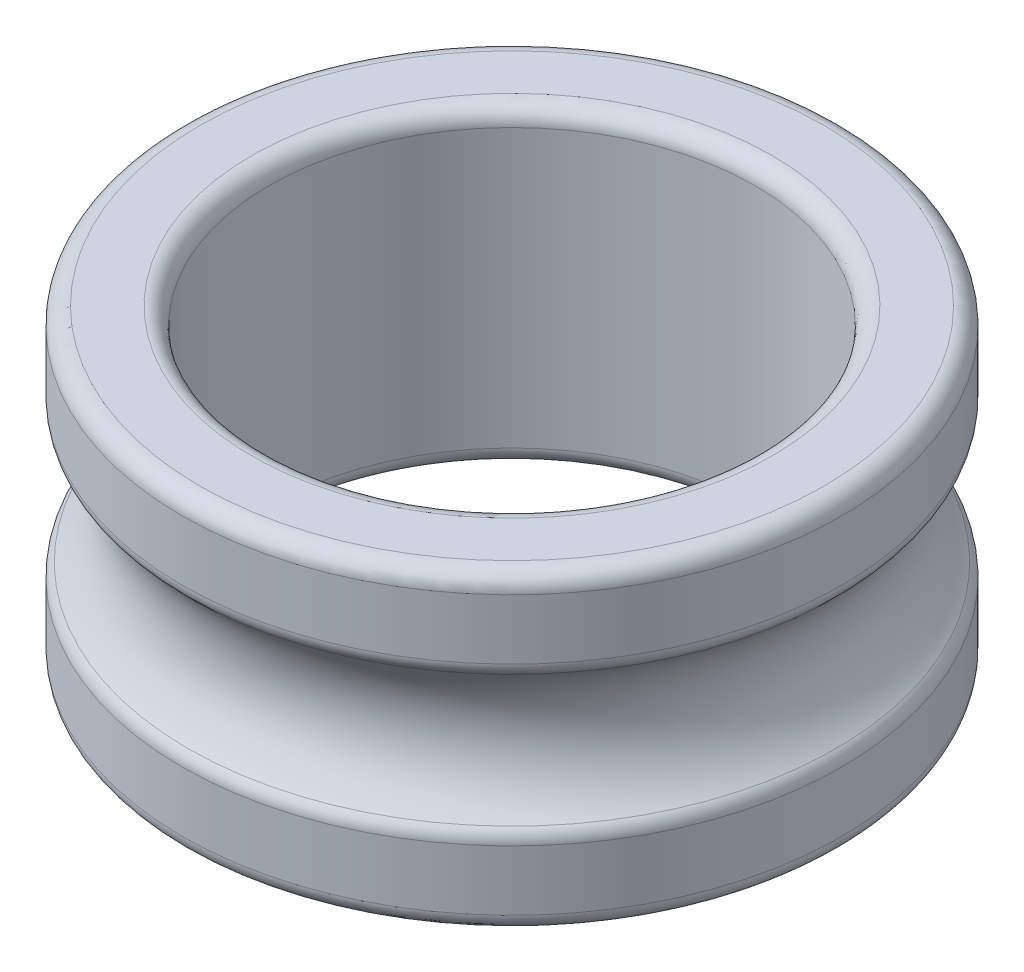
ISO-10303-21;
HEADER;
FILE_DESCRIPTION(('STEP AP214'),'2;1');
FILE_NAME('part.step','',(''),(''),'','','');
FILE_SCHEMA(('AUTOMOTIVE_DESIGN { 1 0 10303 214 1 1 1 1 }'));
ENDSEC;
DATA;
#1=APPLICATION_CONTEXT('core data for automotive mechanical design processes');
#2=APPLICATION_PROTOCOL_DEFINITION('international standard','automotive_design',2000,#1);
#3=PRODUCT_CONTEXT('',#1,'mechanical');
#4=PRODUCT('Part','Part','',(#3));
#5=PRODUCT_RELATED_PRODUCT_CATEGORY('part','',(#4));
#6=PRODUCT_DEFINITION_FORMATION('','',#4);
#7=PRODUCT_DEFINITION_CONTEXT('part definition',#1,'design');
#8=PRODUCT_DEFINITION('design','',#6,#7);
#9=PRODUCT_DEFINITION_SHAPE('','',#8);
#10=(LENGTH_UNIT() NAMED_UNIT(*) SI_UNIT(.MILLI.,.METRE.));
#11=(NAMED_UNIT(*) PLANE_ANGLE_UNIT() SI_UNIT($,.RADIAN.));
#12=(NAMED_UNIT(*) SI_UNIT($,.STERADIAN.) SOLID_ANGLE_UNIT());
#13=UNCERTAINTY_MEASURE_WITH_UNIT(LENGTH_MEASURE(1.E-05),#10,'distance_accuracy_value','');
#14=(GEOMETRIC_REPRESENTATION_CONTEXT(3) GLOBAL_UNCERTAINTY_ASSIGNED_CONTEXT((#13)) GLOBAL_UNIT_ASSIGNED_CONTEXT((#10,
#11,#12)) REPRESENTATION_CONTEXT('',''));
#15=CARTESIAN_POINT('',(0.,0.,0.));
#16=DIRECTION('',(0.,0.,1.));
#17=DIRECTION('',(1.,0.,0.));
#18=AXIS2_PLACEMENT_3D('',#15,#16,#17);
#19=CARTESIAN_POINT('',(0.,-4.53899768671455,0.));
#20=DIRECTION('',(0.,-1.,0.));
#21=DIRECTION('',(0.,0.,-1.));
#22=AXIS2_PLACEMENT_3D('',#19,#20,#21);
#23=TOROIDAL_SURFACE('',#22,18.,1.);
#24=CARTESIAN_POINT('',(0.,-3.78875013519148,0.));
#25=DIRECTION('',(0.,-1.,0.));
#26=DIRECTION('',(0.,0.,-1.));
#27=AXIS2_PLACEMENT_3D('',#24,#25,#26);
#28=CIRCLE('',#27,18.6611570247934);
#29=CARTESIAN_POINT('',(0.,-3.78875013519148,-18.6611570247934));
#30=VERTEX_POINT('',#29);
#31=EDGE_CURVE('E74',#30,#30,#28,.T.);
#32=ORIENTED_EDGE('',*,*,#31,.T.);
#33=EDGE_LOOP('',(#32));
#34=FACE_BOUND('',#33,.T.);
#35=CARTESIAN_POINT('',(0.,-4.53899768671455,0.));
#36=DIRECTION('',(0.,-1.,0.));
#37=DIRECTION('',(0.,0.,-1.));
#38=AXIS2_PLACEMENT_3D('',#35,#36,#37);
#39=CIRCLE('',#38,19.);
#40=CARTESIAN_POINT('',(0.,-4.53899768671455,-19.));
#41=VERTEX_POINT('',#40);
#42=EDGE_CURVE('E10',#41,#41,#39,.T.);
#43=ORIENTED_EDGE('',*,*,#42,.F.);
#44=EDGE_LOOP('',(#43));
#45=FACE_BOUND('',#44,.T.);
#46=ADVANCED_FACE('F34',(#34,#45),#23,.T.);
#47=CARTESIAN_POINT('',(0.,-9.81077416314919,0.));
#48=DIRECTION('',(0.,-1.,0.));
#49=DIRECTION('',(0.,0.,-1.));
#50=AXIS2_PLACEMENT_3D('',#47,#48,#49);
#51=CYLINDRICAL_SURFACE('',#50,19.);
#52=ORIENTED_EDGE('',*,*,#42,.T.);
#53=EDGE_LOOP('',(#52));
#54=FACE_BOUND('',#53,.T.);
#55=CARTESIAN_POINT('',(0.,-8.,0.));
#56=DIRECTION('',(0.,-1.,0.));
#57=DIRECTION('',(0.,0.,-1.));
#58=AXIS2_PLACEMENT_3D('',#55,#56,#57);
#59=CIRCLE('',#58,19.);
#60=CARTESIAN_POINT('',(0.,-8.,-19.));
#61=VERTEX_POINT('',#60);
#62=EDGE_CURVE('E40',#61,#61,#59,.T.);
#63=ORIENTED_EDGE('',*,*,#62,.F.);
#64=EDGE_LOOP('',(#63));
#65=FACE_BOUND('',#64,.T.);
#66=ADVANCED_FACE('F92',(#54,#65),#51,.T.);
#67=CARTESIAN_POINT('',(0.,-8.,0.));
#68=DIRECTION('',(0.,-1.,0.));
#69=DIRECTION('',(0.,0.,-1.));
#70=AXIS2_PLACEMENT_3D('',#67,#68,#69);
#71=TOROIDAL_SURFACE('',#70,18.,1.);
#72=ORIENTED_EDGE('',*,*,#62,.T.);
#73=EDGE_LOOP('',(#72));
#74=FACE_BOUND('',#73,.T.);
#75=CARTESIAN_POINT('',(0.,-9.,0.));
#76=DIRECTION('',(0.,-1.,0.));
#77=DIRECTION('',(0.,0.,-1.));
#78=AXIS2_PLACEMENT_3D('',#75,#76,#77);
#79=CIRCLE('',#78,18.);
#80=CARTESIAN_POINT('',(0.,-9.,-18.));
#81=VERTEX_POINT('',#80);
#82=EDGE_CURVE('E44',#81,#81,#79,.T.);
#83=ORIENTED_EDGE('',*,*,#82,.F.);
#84=EDGE_LOOP('',(#83));
#85=FACE_BOUND('',#84,.T.);
#86=ADVANCED_FACE('F96',(#74,#85),#71,.T.);
#87=CARTESIAN_POINT('',(0.,-9.,-15.));
#88=DIRECTION('',(0.,-1.,0.));
#89=DIRECTION('',(0.,0.,-1.));
#90=AXIS2_PLACEMENT_3D('',#87,#88,#89);
#91=PLANE('',#90);
#92=ORIENTED_EDGE('',*,*,#82,.T.);
#93=EDGE_LOOP('',(#92));
#94=FACE_BOUND('',#93,.T.);
#95=CARTESIAN_POINT('',(0.,-9.,0.));
#96=DIRECTION('',(0.,-1.,0.));
#97=DIRECTION('',(0.,0.,-1.));
#98=AXIS2_PLACEMENT_3D('',#95,#96,#97);
#99=CIRCLE('',#98,15.);
#100=CARTESIAN_POINT('',(0.,-9.,-15.));
#101=VERTEX_POINT('',#100);
#102=EDGE_CURVE('E48',#101,#101,#99,.T.);
#103=ORIENTED_EDGE('',*,*,#102,.F.);
#104=EDGE_LOOP('',(#103));
#105=FACE_BOUND('',#104,.T.);
#106=ADVANCED_FACE('F100',(#94,#105),#91,.T.);
#107=CARTESIAN_POINT('',(0.,-8.,0.));
#108=DIRECTION('',(0.,-1.,0.));
#109=DIRECTION('',(0.,0.,-1.));
#110=AXIS2_PLACEMENT_3D('',#107,#108,#109);
#111=TOROIDAL_SURFACE('',#110,15.,1.);
#112=ORIENTED_EDGE('',*,*,#102,.T.);
#113=EDGE_LOOP('',(#112));
#114=FACE_BOUND('',#113,.T.);
#115=CARTESIAN_POINT('',(0.,-8.,0.));
#116=DIRECTION('',(0.,-1.,0.));
#117=DIRECTION('',(0.,0.,-1.));
#118=AXIS2_PLACEMENT_3D('',#115,#116,#117);
#119=CIRCLE('',#118,14.);
#120=CARTESIAN_POINT('',(0.,-8.,-14.));
#121=VERTEX_POINT('',#120);
#122=EDGE_CURVE('E53',#121,#121,#119,.T.);
#123=ORIENTED_EDGE('',*,*,#122,.F.);
#124=EDGE_LOOP('',(#123));
#125=FACE_BOUND('',#124,.T.);
#126=ADVANCED_FACE('F106',(#114,#125),#111,.T.);
#127=CARTESIAN_POINT('',(0.,-9.81077416314919,0.));
#128=DIRECTION('',(0.,-1.,0.));
#129=DIRECTION('',(0.,0.,-1.));
#130=AXIS2_PLACEMENT_3D('',#127,#128,#129);
#131=CYLINDRICAL_SURFACE('',#130,14.);
#132=ORIENTED_EDGE('',*,*,#122,.T.);
#133=EDGE_LOOP('',(#132));
#134=FACE_BOUND('',#133,.T.);
#135=CARTESIAN_POINT('',(0.,8.,0.));
#136=DIRECTION('',(0.,-1.,0.));
#137=DIRECTION('',(0.,0.,-1.));
#138=AXIS2_PLACEMENT_3D('',#135,#136,#137);
#139=CIRCLE('',#138,14.);
#140=CARTESIAN_POINT('',(0.,8.,-14.));
#141=VERTEX_POINT('',#140);
#142=EDGE_CURVE('E56',#141,#141,#139,.T.);
#143=ORIENTED_EDGE('',*,*,#142,.F.);
#144=EDGE_LOOP('',(#143));
#145=FACE_BOUND('',#144,.T.);
#146=ADVANCED_FACE('F110',(#134,#145),#131,.F.);
#147=CARTESIAN_POINT('',(0.,8.,0.));
#148=DIRECTION('',(0.,-1.,0.));
#149=DIRECTION('',(0.,0.,-1.));
#150=AXIS2_PLACEMENT_3D('',#147,#148,#149);
#151=TOROIDAL_SURFACE('',#150,15.,1.);
#152=ORIENTED_EDGE('',*,*,#142,.T.);
#153=EDGE_LOOP('',(#152));
#154=FACE_BOUND('',#153,.T.);
#155=CARTESIAN_POINT('',(0.,9.,0.));
#156=DIRECTION('',(0.,-1.,0.));
#157=DIRECTION('',(0.,0.,-1.));
#158=AXIS2_PLACEMENT_3D('',#155,#156,#157);
#159=CIRCLE('',#158,15.);
#160=CARTESIAN_POINT('',(0.,9.,-15.));
#161=VERTEX_POINT('',#160);
#162=EDGE_CURVE('E59',#161,#161,#159,.T.);
#163=ORIENTED_EDGE('',*,*,#162,.F.);
#164=EDGE_LOOP('',(#163));
#165=FACE_BOUND('',#164,.T.);
#166=ADVANCED_FACE('F114',(#154,#165),#151,.T.);
#167=CARTESIAN_POINT('',(0.,9.,-18.));
#168=DIRECTION('',(0.,1.,0.));
#169=DIRECTION('',(0.,0.,1.));
#170=AXIS2_PLACEMENT_3D('',#167,#168,#169);
#171=PLANE('',#170);
#172=ORIENTED_EDGE('',*,*,#162,.T.);
#173=EDGE_LOOP('',(#172));
#174=FACE_BOUND('',#173,.T.);
#175=CARTESIAN_POINT('',(0.,9.,0.));
#176=DIRECTION('',(0.,-1.,0.));
#177=DIRECTION('',(0.,0.,-1.));
#178=AXIS2_PLACEMENT_3D('',#175,#176,#177);
#179=CIRCLE('',#178,18.);
#180=CARTESIAN_POINT('',(0.,9.,-18.));
#181=VERTEX_POINT('',#180);
#182=EDGE_CURVE('E62',#181,#181,#179,.T.);
#183=ORIENTED_EDGE('',*,*,#182,.F.);
#184=EDGE_LOOP('',(#183));
#185=FACE_BOUND('',#184,.T.);
#186=ADVANCED_FACE('F118',(#174,#185),#171,.T.);
#187=CARTESIAN_POINT('',(0.,8.,0.));
#188=DIRECTION('',(0.,-1.,0.));
#189=DIRECTION('',(0.,0.,-1.));
#190=AXIS2_PLACEMENT_3D('',#187,#188,#189);
#191=TOROIDAL_SURFACE('',#190,18.,1.);
#192=ORIENTED_EDGE('',*,*,#182,.T.);
#193=EDGE_LOOP('',(#192));
#194=FACE_BOUND('',#193,.T.);
#195=CARTESIAN_POINT('',(0.,8.,0.));
#196=DIRECTION('',(0.,-1.,0.));
#197=DIRECTION('',(0.,0.,-1.));
#198=AXIS2_PLACEMENT_3D('',#195,#196,#197);
#199=CIRCLE('',#198,19.);
#200=CARTESIAN_POINT('',(0.,8.,-19.));
#201=VERTEX_POINT('',#200);
#202=EDGE_CURVE('E65',#201,#201,#199,.T.);
#203=ORIENTED_EDGE('',*,*,#202,.F.);
#204=EDGE_LOOP('',(#203));
#205=FACE_BOUND('',#204,.T.);
#206=ADVANCED_FACE('F122',(#194,#205),#191,.T.);
#207=CARTESIAN_POINT('',(0.,-9.81077416314919,0.));
#208=DIRECTION('',(0.,-1.,0.));
#209=DIRECTION('',(0.,0.,-1.));
#210=AXIS2_PLACEMENT_3D('',#207,#208,#209);
#211=CYLINDRICAL_SURFACE('',#210,19.);
#212=ORIENTED_EDGE('',*,*,#202,.T.);
#213=EDGE_LOOP('',(#212));
#214=FACE_BOUND('',#213,.T.);
#215=CARTESIAN_POINT('',(0.,4.53899768671455,0.));
#216=DIRECTION('',(0.,-1.,0.));
#217=DIRECTION('',(0.,0.,-1.));
#218=AXIS2_PLACEMENT_3D('',#215,#216,#217);
#219=CIRCLE('',#218,19.);
#220=CARTESIAN_POINT('',(0.,4.53899768671455,-19.));
#221=VERTEX_POINT('',#220);
#222=EDGE_CURVE('E68',#221,#221,#219,.T.);
#223=ORIENTED_EDGE('',*,*,#222,.F.);
#224=EDGE_LOOP('',(#223));
#225=FACE_BOUND('',#224,.T.);
#226=ADVANCED_FACE('F88',(#214,#225),#211,.T.);
#227=CARTESIAN_POINT('',(0.,4.53899768671455,0.));
#228=DIRECTION('',(0.,-1.,0.));
#229=DIRECTION('',(0.,0.,-1.));
#230=AXIS2_PLACEMENT_3D('',#227,#228,#229);
#231=TOROIDAL_SURFACE('',#230,18.,1.);
#232=ORIENTED_EDGE('',*,*,#222,.T.);
#233=EDGE_LOOP('',(#232));
#234=FACE_BOUND('',#233,.T.);
#235=CARTESIAN_POINT('',(0.,3.78875013519148,0.));
#236=DIRECTION('',(0.,-1.,0.));
#237=DIRECTION('',(0.,0.,-1.));
#238=AXIS2_PLACEMENT_3D('',#235,#236,#237);
#239=CIRCLE('',#238,18.6611570247934);
#240=CARTESIAN_POINT('',(0.,3.78875013519148,-18.6611570247934));
#241=VERTEX_POINT('',#240);
#242=EDGE_CURVE('E71',#241,#241,#239,.T.);
#243=ORIENTED_EDGE('',*,*,#242,.F.);
#244=EDGE_LOOP('',(#243));
#245=FACE_BOUND('',#244,.T.);
#246=ADVANCED_FACE('F82',(#234,#245),#231,.T.);
#247=CARTESIAN_POINT('',(0.,0.,0.));
#248=DIRECTION('',(0.,-1.,0.));
#249=DIRECTION('',(0.,0.,-1.));
#250=AXIS2_PLACEMENT_3D('',#247,#248,#249);
#251=TOROIDAL_SURFACE('',#250,22.,5.05);
#252=ORIENTED_EDGE('',*,*,#242,.T.);
#253=EDGE_LOOP('',(#252));
#254=FACE_BOUND('',#253,.T.);
#255=ORIENTED_EDGE('',*,*,#31,.F.);
#256=EDGE_LOOP('',(#255));
#257=FACE_BOUND('',#256,.T.);
#258=ADVANCED_FACE('F80',(#254,#257),#251,.F.);
#259=CLOSED_SHELL('',(#46,#66,#86,#106,#126,#146,#166,#186,#206,#226,#246,#258));
#260=MANIFOLD_SOLID_BREP('B2',#259);
#261=ADVANCED_BREP_SHAPE_REPRESENTATION('',(#18,#260),#14);
#262=SHAPE_DEFINITION_REPRESENTATION(#9,#261);
ENDSEC;
END-ISO-10303-21;
